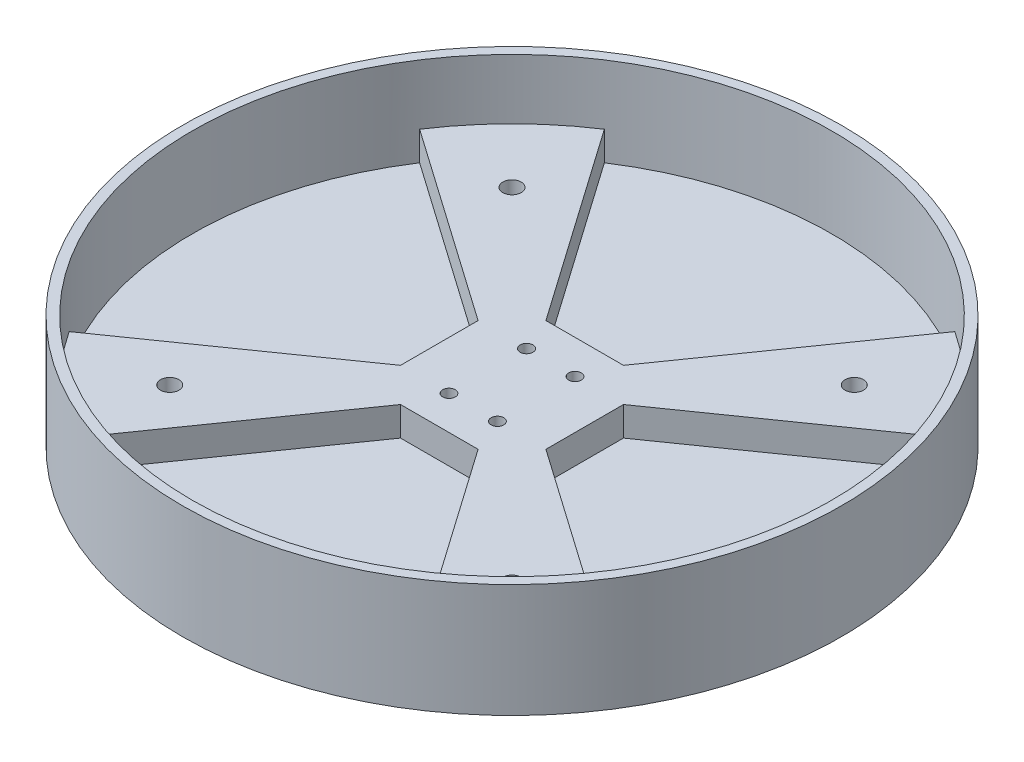
ISO-10303-21;
HEADER;
FILE_DESCRIPTION(('STEP AP214'),'2;1');
FILE_NAME('part.step','',(''),(''),'','','');
FILE_SCHEMA(('AUTOMOTIVE_DESIGN { 1 0 10303 214 1 1 1 1 }'));
ENDSEC;
DATA;
#1=APPLICATION_CONTEXT('core data for automotive mechanical design processes');
#2=APPLICATION_PROTOCOL_DEFINITION('international standard','automotive_design',2000,#1);
#3=PRODUCT_CONTEXT('',#1,'mechanical');
#4=PRODUCT('Part','Part','',(#3));
#5=PRODUCT_RELATED_PRODUCT_CATEGORY('part','',(#4));
#6=PRODUCT_DEFINITION_FORMATION('','',#4);
#7=PRODUCT_DEFINITION_CONTEXT('part definition',#1,'design');
#8=PRODUCT_DEFINITION('design','',#6,#7);
#9=PRODUCT_DEFINITION_SHAPE('','',#8);
#10=(LENGTH_UNIT() NAMED_UNIT(*) SI_UNIT(.MILLI.,.METRE.));
#11=(NAMED_UNIT(*) PLANE_ANGLE_UNIT() SI_UNIT($,.RADIAN.));
#12=(NAMED_UNIT(*) SI_UNIT($,.STERADIAN.) SOLID_ANGLE_UNIT());
#13=UNCERTAINTY_MEASURE_WITH_UNIT(LENGTH_MEASURE(1.E-05),#10,'distance_accuracy_value','');
#14=(GEOMETRIC_REPRESENTATION_CONTEXT(3) GLOBAL_UNCERTAINTY_ASSIGNED_CONTEXT((#13)) GLOBAL_UNIT_ASSIGNED_CONTEXT((#10,
#11,#12)) REPRESENTATION_CONTEXT('',''));
#15=CARTESIAN_POINT('',(0.,0.,0.));
#16=DIRECTION('',(0.,0.,1.));
#17=DIRECTION('',(1.,0.,0.));
#18=AXIS2_PLACEMENT_3D('',#15,#16,#17);
#19=CARTESIAN_POINT('',(0.,28.45,0.));
#20=DIRECTION('',(0.,1.,0.));
#21=DIRECTION('',(0.,0.,1.));
#22=AXIS2_PLACEMENT_3D('',#19,#20,#21);
#23=PLANE('',#22);
#24=CARTESIAN_POINT('',(0.,28.45,0.));
#25=DIRECTION('',(0.,1.,0.));
#26=DIRECTION('',(0.,0.,1.));
#27=AXIS2_PLACEMENT_3D('',#24,#25,#26);
#28=CIRCLE('',#27,86.36);
#29=CARTESIAN_POINT('',(0.,28.45,86.36));
#30=VERTEX_POINT('',#29);
#31=EDGE_CURVE('E213',#30,#30,#28,.T.);
#32=ORIENTED_EDGE('',*,*,#31,.T.);
#33=EDGE_LOOP('',(#32));
#34=FACE_BOUND('',#33,.T.);
#35=CARTESIAN_POINT('',(0.,28.45,0.));
#36=DIRECTION('',(0.,1.,0.));
#37=DIRECTION('',(0.,0.,1.));
#38=AXIS2_PLACEMENT_3D('',#35,#36,#37);
#39=CIRCLE('',#38,83.82);
#40=CARTESIAN_POINT('',(0.,28.45,83.82));
#41=VERTEX_POINT('',#40);
#42=EDGE_CURVE('E217',#41,#41,#39,.T.);
#43=ORIENTED_EDGE('',*,*,#42,.F.);
#44=EDGE_LOOP('',(#43));
#45=FACE_BOUND('',#44,.T.);
#46=ADVANCED_FACE('F47',(#34,#45),#23,.T.);
#47=CARTESIAN_POINT('',(0.,28.45,0.));
#48=DIRECTION('',(0.,-1.,0.));
#49=DIRECTION('',(0.,0.,-1.));
#50=AXIS2_PLACEMENT_3D('',#47,#48,#49);
#51=CYLINDRICAL_SURFACE('',#50,86.36);
#52=ORIENTED_EDGE('',*,*,#31,.F.);
#53=EDGE_LOOP('',(#52));
#54=FACE_BOUND('',#53,.T.);
#55=CARTESIAN_POINT('',(0.,-1.27,0.));
#56=DIRECTION('',(0.,1.,0.));
#57=DIRECTION('',(0.,0.,1.));
#58=AXIS2_PLACEMENT_3D('',#55,#56,#57);
#59=CIRCLE('',#58,86.36);
#60=CARTESIAN_POINT('',(0.,-1.27,86.36));
#61=VERTEX_POINT('',#60);
#62=EDGE_CURVE('E225',#61,#61,#59,.T.);
#63=ORIENTED_EDGE('',*,*,#62,.T.);
#64=EDGE_LOOP('',(#63));
#65=FACE_BOUND('',#64,.T.);
#66=ADVANCED_FACE('F51',(#54,#65),#51,.T.);
#67=CARTESIAN_POINT('',(0.,28.45,0.));
#68=DIRECTION('',(0.,-1.,0.));
#69=DIRECTION('',(0.,0.,-1.));
#70=AXIS2_PLACEMENT_3D('',#67,#68,#69);
#71=CYLINDRICAL_SURFACE('',#70,83.82);
#72=CARTESIAN_POINT('',(0.,12.7,0.));
#73=DIRECTION('',(0.,1.,0.));
#74=DIRECTION('',(0.,0.,1.));
#75=AXIS2_PLACEMENT_3D('',#72,#73,#74);
#76=CIRCLE('',#75,83.82);
#77=CARTESIAN_POINT('',(45.920860176019,12.7,70.1218011797651));
#78=VERTEX_POINT('',#77);
#79=CARTESIAN_POINT('',(70.1218011797649,12.7,45.9208601760193));
#80=VERTEX_POINT('',#79);
#81=EDGE_CURVE('E12',#78,#80,#76,.T.);
#82=ORIENTED_EDGE('',*,*,#81,.F.);
#83=DIRECTION('',(0.,1.,0.));
#84=VECTOR('',#83,1.);
#85=CARTESIAN_POINT('',(45.920860176019,5.08,70.1218011797651));
#86=LINE('',#85,#84);
#87=CARTESIAN_POINT('',(45.920860176019,5.08,70.1218011797651));
#88=VERTEX_POINT('',#87);
#89=EDGE_CURVE('E401',#88,#78,#86,.T.);
#90=ORIENTED_EDGE('',*,*,#89,.F.);
#91=CARTESIAN_POINT('',(0.,5.08,0.));
#92=DIRECTION('',(0.,1.,0.));
#93=DIRECTION('',(0.,0.,1.));
#94=AXIS2_PLACEMENT_3D('',#91,#92,#93);
#95=CIRCLE('',#94,83.82);
#96=CARTESIAN_POINT('',(-45.9208601760193,5.08,70.1218011797649));
#97=VERTEX_POINT('',#96);
#98=EDGE_CURVE('E171',#97,#88,#95,.T.);
#99=ORIENTED_EDGE('',*,*,#98,.F.);
#100=DIRECTION('',(0.,1.,0.));
#101=VECTOR('',#100,1.);
#102=CARTESIAN_POINT('',(-45.9208601760193,5.08,70.1218011797649));
#103=LINE('',#102,#101);
#104=CARTESIAN_POINT('',(-45.9208601760193,12.7,70.1218011797649));
#105=VERTEX_POINT('',#104);
#106=EDGE_CURVE('E165',#97,#105,#103,.T.);
#107=ORIENTED_EDGE('',*,*,#106,.T.);
#108=CARTESIAN_POINT('',(-70.1218011797652,12.7,45.920860176019));
#109=VERTEX_POINT('',#108);
#110=EDGE_CURVE('E56',#109,#105,#76,.T.);
#111=ORIENTED_EDGE('',*,*,#110,.F.);
#112=DIRECTION('',(0.,1.,0.));
#113=VECTOR('',#112,1.);
#114=CARTESIAN_POINT('',(-70.1218011797652,5.08,45.920860176019));
#115=LINE('',#114,#113);
#116=CARTESIAN_POINT('',(-70.1218011797652,5.08,45.920860176019));
#117=VERTEX_POINT('',#116);
#118=EDGE_CURVE('E273',#117,#109,#115,.T.);
#119=ORIENTED_EDGE('',*,*,#118,.F.);
#120=CARTESIAN_POINT('',(0.,5.08,0.));
#121=DIRECTION('',(0.,1.,0.));
#122=DIRECTION('',(0.,0.,1.));
#123=AXIS2_PLACEMENT_3D('',#120,#121,#122);
#124=CIRCLE('',#123,83.82);
#125=CARTESIAN_POINT('',(-70.1218011797649,5.08,-45.9208601760194));
#126=VERTEX_POINT('',#125);
#127=EDGE_CURVE('E292',#126,#117,#124,.T.);
#128=ORIENTED_EDGE('',*,*,#127,.F.);
#129=DIRECTION('',(0.,1.,0.));
#130=VECTOR('',#129,1.);
#131=CARTESIAN_POINT('',(-70.1218011797649,5.08,-45.9208601760194));
#132=LINE('',#131,#130);
#133=CARTESIAN_POINT('',(-70.1218011797649,12.7,-45.9208601760194));
#134=VERTEX_POINT('',#133);
#135=EDGE_CURVE('E259',#126,#134,#132,.T.);
#136=ORIENTED_EDGE('',*,*,#135,.T.);
#137=CARTESIAN_POINT('',(-45.920860176019,12.7,-70.1218011797651));
#138=VERTEX_POINT('',#137);
#139=EDGE_CURVE('E195',#138,#134,#76,.T.);
#140=ORIENTED_EDGE('',*,*,#139,.F.);
#141=DIRECTION('',(0.,1.,0.));
#142=VECTOR('',#141,1.);
#143=CARTESIAN_POINT('',(-45.920860176019,5.08,-70.1218011797651));
#144=LINE('',#143,#142);
#145=CARTESIAN_POINT('',(-45.920860176019,5.08,-70.1218011797651));
#146=VERTEX_POINT('',#145);
#147=EDGE_CURVE('E329',#146,#138,#144,.T.);
#148=ORIENTED_EDGE('',*,*,#147,.F.);
#149=CARTESIAN_POINT('',(0.,5.08,0.));
#150=DIRECTION('',(0.,1.,0.));
#151=DIRECTION('',(0.,0.,1.));
#152=AXIS2_PLACEMENT_3D('',#149,#150,#151);
#153=CIRCLE('',#152,83.82);
#154=CARTESIAN_POINT('',(45.9208601760193,5.08,-70.1218011797649));
#155=VERTEX_POINT('',#154);
#156=EDGE_CURVE('E312',#155,#146,#153,.T.);
#157=ORIENTED_EDGE('',*,*,#156,.F.);
#158=DIRECTION('',(0.,1.,0.));
#159=VECTOR('',#158,1.);
#160=CARTESIAN_POINT('',(45.9208601760193,5.08,-70.1218011797649));
#161=LINE('',#160,#159);
#162=CARTESIAN_POINT('',(45.9208601760193,12.7,-70.1218011797649));
#163=VERTEX_POINT('',#162);
#164=EDGE_CURVE('E338',#155,#163,#161,.T.);
#165=ORIENTED_EDGE('',*,*,#164,.T.);
#166=CARTESIAN_POINT('',(70.1218011797651,12.7,-45.920860176019));
#167=VERTEX_POINT('',#166);
#168=EDGE_CURVE('E59',#167,#163,#76,.T.);
#169=ORIENTED_EDGE('',*,*,#168,.F.);
#170=DIRECTION('',(0.,1.,0.));
#171=VECTOR('',#170,1.);
#172=CARTESIAN_POINT('',(70.1218011797651,5.08,-45.920860176019));
#173=LINE('',#172,#171);
#174=CARTESIAN_POINT('',(70.1218011797651,5.08,-45.920860176019));
#175=VERTEX_POINT('',#174);
#176=EDGE_CURVE('E368',#175,#167,#173,.T.);
#177=ORIENTED_EDGE('',*,*,#176,.F.);
#178=CARTESIAN_POINT('',(0.,5.08,0.));
#179=DIRECTION('',(0.,1.,0.));
#180=DIRECTION('',(0.,0.,1.));
#181=AXIS2_PLACEMENT_3D('',#178,#179,#180);
#182=CIRCLE('',#181,83.82);
#183=CARTESIAN_POINT('',(70.1218011797649,5.08,45.9208601760193));
#184=VERTEX_POINT('',#183);
#185=EDGE_CURVE('E353',#184,#175,#182,.T.);
#186=ORIENTED_EDGE('',*,*,#185,.F.);
#187=DIRECTION('',(0.,1.,0.));
#188=VECTOR('',#187,1.);
#189=CARTESIAN_POINT('',(70.1218011797649,5.08,45.9208601760193));
#190=LINE('',#189,#188);
#191=EDGE_CURVE('E377',#184,#80,#190,.T.);
#192=ORIENTED_EDGE('',*,*,#191,.T.);
#193=EDGE_LOOP('',(#82,#90,#99,#107,#111,#119,#128,#136,#140,#148,#157,#165,#169,#177,#186,#192));
#194=FACE_BOUND('',#193,.T.);
#195=ORIENTED_EDGE('',*,*,#42,.T.);
#196=EDGE_LOOP('',(#195));
#197=FACE_BOUND('',#196,.T.);
#198=ADVANCED_FACE('F170',(#194,#197),#71,.F.);
#199=CARTESIAN_POINT('',(0.,-1.27,0.));
#200=DIRECTION('',(0.,1.,0.));
#201=DIRECTION('',(0.,0.,1.));
#202=AXIS2_PLACEMENT_3D('',#199,#200,#201);
#203=PLANE('',#202);
#204=ORIENTED_EDGE('',*,*,#62,.F.);
#205=EDGE_LOOP('',(#204));
#206=FACE_BOUND('',#205,.T.);
#207=ADVANCED_FACE('F451',(#206),#203,.F.);
#208=CARTESIAN_POINT('',(44.845,12.7,-44.845));
#209=DIRECTION('',(0.,-1.,0.));
#210=DIRECTION('',(0.,0.,-1.));
#211=AXIS2_PLACEMENT_3D('',#208,#209,#210);
#212=CYLINDRICAL_SURFACE('',#211,2.41299999999999);
#213=CARTESIAN_POINT('',(44.845,12.7,-44.845));
#214=DIRECTION('',(0.,1.,0.));
#215=DIRECTION('',(0.,0.,1.));
#216=AXIS2_PLACEMENT_3D('',#213,#214,#215);
#217=CIRCLE('',#216,2.41299999999999);
#218=CARTESIAN_POINT('',(44.845,12.7,-42.432));
#219=VERTEX_POINT('',#218);
#220=EDGE_CURVE('E228',#219,#219,#217,.T.);
#221=ORIENTED_EDGE('',*,*,#220,.T.);
#222=EDGE_LOOP('',(#221));
#223=FACE_BOUND('',#222,.T.);
#224=CARTESIAN_POINT('',(44.845,0.,-44.845));
#225=DIRECTION('',(0.,1.,0.));
#226=DIRECTION('',(0.,0.,1.));
#227=AXIS2_PLACEMENT_3D('',#224,#225,#226);
#228=CIRCLE('',#227,2.41299999999999);
#229=CARTESIAN_POINT('',(44.845,0.,-42.432));
#230=VERTEX_POINT('',#229);
#231=EDGE_CURVE('E193',#230,#230,#228,.F.);
#232=ORIENTED_EDGE('',*,*,#231,.T.);
#233=EDGE_LOOP('',(#232));
#234=FACE_BOUND('',#233,.T.);
#235=ADVANCED_FACE('F465',(#223,#234),#212,.F.);
#236=CARTESIAN_POINT('',(44.845,12.7,44.845));
#237=DIRECTION('',(0.,-1.,0.));
#238=DIRECTION('',(0.,0.,-1.));
#239=AXIS2_PLACEMENT_3D('',#236,#237,#238);
#240=CYLINDRICAL_SURFACE('',#239,2.41299999999999);
#241=CARTESIAN_POINT('',(44.845,12.7,44.845));
#242=DIRECTION('',(0.,1.,0.));
#243=DIRECTION('',(0.,0.,1.));
#244=AXIS2_PLACEMENT_3D('',#241,#242,#243);
#245=CIRCLE('',#244,2.41299999999999);
#246=CARTESIAN_POINT('',(44.845,12.7,47.258));
#247=VERTEX_POINT('',#246);
#248=EDGE_CURVE('E229',#247,#247,#245,.T.);
#249=ORIENTED_EDGE('',*,*,#248,.T.);
#250=EDGE_LOOP('',(#249));
#251=FACE_BOUND('',#250,.T.);
#252=CARTESIAN_POINT('',(44.845,0.,44.845));
#253=DIRECTION('',(0.,1.,0.));
#254=DIRECTION('',(0.,0.,1.));
#255=AXIS2_PLACEMENT_3D('',#252,#253,#254);
#256=CIRCLE('',#255,2.41299999999999);
#257=CARTESIAN_POINT('',(44.845,0.,47.258));
#258=VERTEX_POINT('',#257);
#259=EDGE_CURVE('E198',#258,#258,#256,.F.);
#260=ORIENTED_EDGE('',*,*,#259,.T.);
#261=EDGE_LOOP('',(#260));
#262=FACE_BOUND('',#261,.T.);
#263=ADVANCED_FACE('F474',(#251,#262),#240,.F.);
#264=CARTESIAN_POINT('',(-44.845,12.7,44.845));
#265=DIRECTION('',(0.,-1.,0.));
#266=DIRECTION('',(0.,0.,-1.));
#267=AXIS2_PLACEMENT_3D('',#264,#265,#266);
#268=CYLINDRICAL_SURFACE('',#267,2.41299999999999);
#269=CARTESIAN_POINT('',(-44.845,12.7,44.845));
#270=DIRECTION('',(0.,1.,0.));
#271=DIRECTION('',(0.,0.,1.));
#272=AXIS2_PLACEMENT_3D('',#269,#270,#271);
#273=CIRCLE('',#272,2.41299999999999);
#274=CARTESIAN_POINT('',(-44.845,12.7,47.258));
#275=VERTEX_POINT('',#274);
#276=EDGE_CURVE('E234',#275,#275,#273,.T.);
#277=ORIENTED_EDGE('',*,*,#276,.T.);
#278=EDGE_LOOP('',(#277));
#279=FACE_BOUND('',#278,.T.);
#280=CARTESIAN_POINT('',(-44.845,0.,44.845));
#281=DIRECTION('',(0.,1.,0.));
#282=DIRECTION('',(0.,0.,1.));
#283=AXIS2_PLACEMENT_3D('',#280,#281,#282);
#284=CIRCLE('',#283,2.41299999999999);
#285=CARTESIAN_POINT('',(-44.845,0.,47.258));
#286=VERTEX_POINT('',#285);
#287=EDGE_CURVE('E204',#286,#286,#284,.F.);
#288=ORIENTED_EDGE('',*,*,#287,.T.);
#289=EDGE_LOOP('',(#288));
#290=FACE_BOUND('',#289,.T.);
#291=ADVANCED_FACE('F470',(#279,#290),#268,.F.);
#292=CARTESIAN_POINT('',(-44.845,12.7,-44.845));
#293=DIRECTION('',(0.,-1.,0.));
#294=DIRECTION('',(0.,0.,-1.));
#295=AXIS2_PLACEMENT_3D('',#292,#293,#294);
#296=CYLINDRICAL_SURFACE('',#295,2.41299999999999);
#297=CARTESIAN_POINT('',(-44.845,12.7,-44.845));
#298=DIRECTION('',(0.,1.,0.));
#299=DIRECTION('',(0.,0.,1.));
#300=AXIS2_PLACEMENT_3D('',#297,#298,#299);
#301=CIRCLE('',#300,2.41299999999999);
#302=CARTESIAN_POINT('',(-44.845,12.7,-42.432));
#303=VERTEX_POINT('',#302);
#304=EDGE_CURVE('E238',#303,#303,#301,.T.);
#305=ORIENTED_EDGE('',*,*,#304,.T.);
#306=EDGE_LOOP('',(#305));
#307=FACE_BOUND('',#306,.T.);
#308=CARTESIAN_POINT('',(-44.845,0.,-44.845));
#309=DIRECTION('',(0.,1.,0.));
#310=DIRECTION('',(0.,0.,1.));
#311=AXIS2_PLACEMENT_3D('',#308,#309,#310);
#312=CIRCLE('',#311,2.41299999999999);
#313=CARTESIAN_POINT('',(-44.845,0.,-42.432));
#314=VERTEX_POINT('',#313);
#315=EDGE_CURVE('E208',#314,#314,#312,.F.);
#316=ORIENTED_EDGE('',*,*,#315,.T.);
#317=EDGE_LOOP('',(#316));
#318=FACE_BOUND('',#317,.T.);
#319=ADVANCED_FACE('F464',(#307,#318),#296,.F.);
#320=CARTESIAN_POINT('',(0.,12.7,0.));
#321=DIRECTION('',(0.,1.,0.));
#322=DIRECTION('',(0.,0.,1.));
#323=AXIS2_PLACEMENT_3D('',#320,#321,#322);
#324=PLANE('',#323);
#325=DIRECTION('',(-0.819152044288991,0.,0.573576436351047));
#326=VECTOR('',#325,1.);
#327=CARTESIAN_POINT('',(70.1218011797651,12.7,-45.920860176019));
#328=LINE('',#327,#326);
#329=CARTESIAN_POINT('',(19.0500000000001,12.7,-10.1599999999999));
#330=VERTEX_POINT('',#329);
#331=EDGE_CURVE('E66',#167,#330,#328,.T.);
#332=ORIENTED_EDGE('',*,*,#331,.F.);
#333=ORIENTED_EDGE('',*,*,#168,.T.);
#334=DIRECTION('',(0.573576436351049,0.,-0.81915204428899));
#335=VECTOR('',#334,1.);
#336=CARTESIAN_POINT('',(45.9208601760193,12.7,-70.1218011797649));
#337=LINE('',#336,#335);
#338=CARTESIAN_POINT('',(10.1600000000001,12.7,-19.05));
#339=VERTEX_POINT('',#338);
#340=EDGE_CURVE('E320',#339,#163,#337,.T.);
#341=ORIENTED_EDGE('',*,*,#340,.F.);
#342=DIRECTION('',(1.,0.,0.));
#343=VECTOR('',#342,1.);
#344=CARTESIAN_POINT('',(-10.1599999999999,12.7,-19.05));
#345=LINE('',#344,#343);
#346=CARTESIAN_POINT('',(-10.1599999999999,12.7,-19.05));
#347=VERTEX_POINT('',#346);
#348=EDGE_CURVE('E331',#347,#339,#345,.T.);
#349=ORIENTED_EDGE('',*,*,#348,.F.);
#350=DIRECTION('',(0.573576436351046,0.,0.819152044288992));
#351=VECTOR('',#350,1.);
#352=CARTESIAN_POINT('',(-45.920860176019,12.7,-70.1218011797651));
#353=LINE('',#352,#351);
#354=EDGE_CURVE('E74',#138,#347,#353,.T.);
#355=ORIENTED_EDGE('',*,*,#354,.F.);
#356=ORIENTED_EDGE('',*,*,#139,.T.);
#357=DIRECTION('',(-0.819152044288989,0.,-0.57357643635105));
#358=VECTOR('',#357,1.);
#359=CARTESIAN_POINT('',(-70.1218011797649,12.7,-45.9208601760194));
#360=LINE('',#359,#358);
#361=CARTESIAN_POINT('',(-19.05,12.7,-10.16));
#362=VERTEX_POINT('',#361);
#363=EDGE_CURVE('E286',#362,#134,#360,.T.);
#364=ORIENTED_EDGE('',*,*,#363,.F.);
#365=DIRECTION('',(0.,0.,-1.));
#366=VECTOR('',#365,1.);
#367=CARTESIAN_POINT('',(-19.05,12.7,10.16));
#368=LINE('',#367,#366);
#369=CARTESIAN_POINT('',(-19.05,12.7,10.16));
#370=VERTEX_POINT('',#369);
#371=EDGE_CURVE('E291',#370,#362,#368,.T.);
#372=ORIENTED_EDGE('',*,*,#371,.F.);
#373=DIRECTION('',(0.819152044288993,0.,-0.573576436351044));
#374=VECTOR('',#373,1.);
#375=CARTESIAN_POINT('',(-70.1218011797652,12.7,45.920860176019));
#376=LINE('',#375,#374);
#377=EDGE_CURVE('E194',#109,#370,#376,.T.);
#378=ORIENTED_EDGE('',*,*,#377,.F.);
#379=ORIENTED_EDGE('',*,*,#110,.T.);
#380=DIRECTION('',(-0.573576436351047,0.,0.819152044288991));
#381=VECTOR('',#380,1.);
#382=CARTESIAN_POINT('',(-45.9208601760193,12.7,70.1218011797649));
#383=LINE('',#382,#381);
#384=CARTESIAN_POINT('',(-10.1600000000002,12.7,19.0499999999999));
#385=VERTEX_POINT('',#384);
#386=EDGE_CURVE('E177',#385,#105,#383,.T.);
#387=ORIENTED_EDGE('',*,*,#386,.F.);
#388=DIRECTION('',(-1.,0.,0.));
#389=VECTOR('',#388,1.);
#390=CARTESIAN_POINT('',(10.1599999999998,12.7,19.0500000000001));
#391=LINE('',#390,#389);
#392=CARTESIAN_POINT('',(10.1599999999998,12.7,19.0500000000001));
#393=VERTEX_POINT('',#392);
#394=EDGE_CURVE('E184',#393,#385,#391,.T.);
#395=ORIENTED_EDGE('',*,*,#394,.F.);
#396=DIRECTION('',(-0.573576436351048,0.,-0.819152044288991));
#397=VECTOR('',#396,1.);
#398=CARTESIAN_POINT('',(45.920860176019,12.7,70.1218011797651));
#399=LINE('',#398,#397);
#400=EDGE_CURVE('E385',#78,#393,#399,.T.);
#401=ORIENTED_EDGE('',*,*,#400,.F.);
#402=ORIENTED_EDGE('',*,*,#81,.T.);
#403=DIRECTION('',(0.81915204428899,0.,0.573576436351048));
#404=VECTOR('',#403,1.);
#405=CARTESIAN_POINT('',(70.1218011797649,12.7,45.9208601760193));
#406=LINE('',#405,#404);
#407=CARTESIAN_POINT('',(19.0499999999999,12.7,10.1600000000001));
#408=VERTEX_POINT('',#407);
#409=EDGE_CURVE('E352',#408,#80,#406,.T.);
#410=ORIENTED_EDGE('',*,*,#409,.F.);
#411=DIRECTION('',(0.,0.,1.));
#412=VECTOR('',#411,1.);
#413=CARTESIAN_POINT('',(19.0500000000001,12.7,-10.1599999999999));
#414=LINE('',#413,#412);
#415=EDGE_CURVE('E371',#330,#408,#414,.T.);
#416=ORIENTED_EDGE('',*,*,#415,.F.);
#417=EDGE_LOOP('',(#332,#333,#341,#349,#355,#356,#364,#372,#378,#379,#387,#395,#401,#402,#410,#416));
#418=FACE_BOUND('',#417,.T.);
#419=CARTESIAN_POINT('',(-6.35,12.7,-10.16));
#420=DIRECTION('',(0.,1.,0.));
#421=DIRECTION('',(0.,0.,1.));
#422=AXIS2_PLACEMENT_3D('',#419,#420,#421);
#423=CIRCLE('',#422,1.68128652093225);
#424=CARTESIAN_POINT('',(-6.35,12.7,-8.47871347906775));
#425=VERTEX_POINT('',#424);
#426=EDGE_CURVE('E253',#425,#425,#423,.T.);
#427=ORIENTED_EDGE('',*,*,#426,.F.);
#428=EDGE_LOOP('',(#427));
#429=FACE_BOUND('',#428,.T.);
#430=CARTESIAN_POINT('',(-6.35,12.7,10.16));
#431=DIRECTION('',(0.,1.,0.));
#432=DIRECTION('',(0.,0.,1.));
#433=AXIS2_PLACEMENT_3D('',#430,#431,#432);
#434=CIRCLE('',#433,1.651);
#435=CARTESIAN_POINT('',(-6.35,12.7,11.811));
#436=VERTEX_POINT('',#435);
#437=EDGE_CURVE('E263',#436,#436,#434,.T.);
#438=ORIENTED_EDGE('',*,*,#437,.F.);
#439=EDGE_LOOP('',(#438));
#440=FACE_BOUND('',#439,.T.);
#441=CARTESIAN_POINT('',(6.35,12.7,10.16));
#442=DIRECTION('',(0.,1.,0.));
#443=DIRECTION('',(0.,0.,1.));
#444=AXIS2_PLACEMENT_3D('',#441,#442,#443);
#445=CIRCLE('',#444,1.651);
#446=CARTESIAN_POINT('',(6.35,12.7,11.811));
#447=VERTEX_POINT('',#446);
#448=EDGE_CURVE('E250',#447,#447,#445,.T.);
#449=ORIENTED_EDGE('',*,*,#448,.F.);
#450=EDGE_LOOP('',(#449));
#451=FACE_BOUND('',#450,.T.);
#452=CARTESIAN_POINT('',(6.35,12.7,-10.16));
#453=DIRECTION('',(0.,1.,0.));
#454=DIRECTION('',(0.,0.,1.));
#455=AXIS2_PLACEMENT_3D('',#452,#453,#454);
#456=CIRCLE('',#455,1.651);
#457=CARTESIAN_POINT('',(6.35,12.7,-8.509));
#458=VERTEX_POINT('',#457);
#459=EDGE_CURVE('E243',#458,#458,#456,.T.);
#460=ORIENTED_EDGE('',*,*,#459,.F.);
#461=EDGE_LOOP('',(#460));
#462=FACE_BOUND('',#461,.T.);
#463=ORIENTED_EDGE('',*,*,#304,.F.);
#464=EDGE_LOOP('',(#463));
#465=FACE_BOUND('',#464,.T.);
#466=ORIENTED_EDGE('',*,*,#276,.F.);
#467=EDGE_LOOP('',(#466));
#468=FACE_BOUND('',#467,.T.);
#469=ORIENTED_EDGE('',*,*,#248,.F.);
#470=EDGE_LOOP('',(#469));
#471=FACE_BOUND('',#470,.T.);
#472=ORIENTED_EDGE('',*,*,#220,.F.);
#473=EDGE_LOOP('',(#472));
#474=FACE_BOUND('',#473,.T.);
#475=ADVANCED_FACE('F189',(#418,#429,#440,#451,#462,#465,#468,#471,#474),#324,.T.);
#476=CARTESIAN_POINT('',(0.,0.,0.));
#477=DIRECTION('',(0.,1.,0.));
#478=DIRECTION('',(0.,0.,1.));
#479=AXIS2_PLACEMENT_3D('',#476,#477,#478);
#480=PLANE('',#479);
#481=ORIENTED_EDGE('',*,*,#315,.F.);
#482=EDGE_LOOP('',(#481));
#483=FACE_BOUND('',#482,.T.);
#484=ADVANCED_FACE('F458',(#483),#480,.T.);
#485=ORIENTED_EDGE('',*,*,#287,.F.);
#486=EDGE_LOOP('',(#485));
#487=FACE_BOUND('',#486,.T.);
#488=ADVANCED_FACE('F718',(#487),#480,.T.);
#489=ORIENTED_EDGE('',*,*,#259,.F.);
#490=EDGE_LOOP('',(#489));
#491=FACE_BOUND('',#490,.T.);
#492=ADVANCED_FACE('F460',(#491),#480,.T.);
#493=ORIENTED_EDGE('',*,*,#231,.F.);
#494=EDGE_LOOP('',(#493));
#495=FACE_BOUND('',#494,.T.);
#496=ADVANCED_FACE('F455',(#495),#480,.T.);
#497=CARTESIAN_POINT('',(6.35,10.16,-10.16));
#498=DIRECTION('',(0.,1.,0.));
#499=DIRECTION('',(0.,0.,1.));
#500=AXIS2_PLACEMENT_3D('',#497,#498,#499);
#501=CYLINDRICAL_SURFACE('',#500,1.651);
#502=CARTESIAN_POINT('',(6.35,10.16,-10.16));
#503=DIRECTION('',(0.,1.,0.));
#504=DIRECTION('',(0.,0.,1.));
#505=AXIS2_PLACEMENT_3D('',#502,#503,#504);
#506=CIRCLE('',#505,1.651);
#507=CARTESIAN_POINT('',(6.35,10.16,-8.509));
#508=VERTEX_POINT('',#507);
#509=EDGE_CURVE('E245',#508,#508,#506,.T.);
#510=ORIENTED_EDGE('',*,*,#509,.F.);
#511=EDGE_LOOP('',(#510));
#512=FACE_BOUND('',#511,.T.);
#513=ORIENTED_EDGE('',*,*,#459,.T.);
#514=EDGE_LOOP('',(#513));
#515=FACE_BOUND('',#514,.T.);
#516=ADVANCED_FACE('F456',(#512,#515),#501,.F.);
#517=CARTESIAN_POINT('',(6.35,10.16,-10.16));
#518=DIRECTION('',(0.,1.,0.));
#519=DIRECTION('',(0.,0.,1.));
#520=AXIS2_PLACEMENT_3D('',#517,#518,#519);
#521=PLANE('',#520);
#522=ORIENTED_EDGE('',*,*,#509,.T.);
#523=EDGE_LOOP('',(#522));
#524=FACE_BOUND('',#523,.T.);
#525=ADVANCED_FACE('F481',(#524),#521,.T.);
#526=CARTESIAN_POINT('',(6.35,10.16,10.16));
#527=DIRECTION('',(0.,1.,0.));
#528=DIRECTION('',(0.,0.,1.));
#529=AXIS2_PLACEMENT_3D('',#526,#527,#528);
#530=CYLINDRICAL_SURFACE('',#529,1.651);
#531=CARTESIAN_POINT('',(6.35,10.16,10.16));
#532=DIRECTION('',(0.,1.,0.));
#533=DIRECTION('',(0.,0.,1.));
#534=AXIS2_PLACEMENT_3D('',#531,#532,#533);
#535=CIRCLE('',#534,1.651);
#536=CARTESIAN_POINT('',(6.35,10.16,11.811));
#537=VERTEX_POINT('',#536);
#538=EDGE_CURVE('E266',#537,#537,#535,.T.);
#539=ORIENTED_EDGE('',*,*,#538,.F.);
#540=EDGE_LOOP('',(#539));
#541=FACE_BOUND('',#540,.T.);
#542=ORIENTED_EDGE('',*,*,#448,.T.);
#543=EDGE_LOOP('',(#542));
#544=FACE_BOUND('',#543,.T.);
#545=ADVANCED_FACE('F487',(#541,#544),#530,.F.);
#546=CARTESIAN_POINT('',(6.35,10.16,10.16));
#547=DIRECTION('',(0.,1.,0.));
#548=DIRECTION('',(0.,0.,1.));
#549=AXIS2_PLACEMENT_3D('',#546,#547,#548);
#550=PLANE('',#549);
#551=ORIENTED_EDGE('',*,*,#538,.T.);
#552=EDGE_LOOP('',(#551));
#553=FACE_BOUND('',#552,.T.);
#554=ADVANCED_FACE('F504',(#553),#550,.T.);
#555=CARTESIAN_POINT('',(-6.35,10.16,10.16));
#556=DIRECTION('',(0.,1.,0.));
#557=DIRECTION('',(0.,0.,1.));
#558=AXIS2_PLACEMENT_3D('',#555,#556,#557);
#559=CYLINDRICAL_SURFACE('',#558,1.651);
#560=CARTESIAN_POINT('',(-6.35,10.16,10.16));
#561=DIRECTION('',(0.,1.,0.));
#562=DIRECTION('',(0.,0.,1.));
#563=AXIS2_PLACEMENT_3D('',#560,#561,#562);
#564=CIRCLE('',#563,1.651);
#565=CARTESIAN_POINT('',(-6.35,10.16,11.811));
#566=VERTEX_POINT('',#565);
#567=EDGE_CURVE('E257',#566,#566,#564,.T.);
#568=ORIENTED_EDGE('',*,*,#567,.F.);
#569=EDGE_LOOP('',(#568));
#570=FACE_BOUND('',#569,.T.);
#571=ORIENTED_EDGE('',*,*,#437,.T.);
#572=EDGE_LOOP('',(#571));
#573=FACE_BOUND('',#572,.T.);
#574=ADVANCED_FACE('F501',(#570,#573),#559,.F.);
#575=CARTESIAN_POINT('',(-6.35,10.16,10.16));
#576=DIRECTION('',(0.,1.,0.));
#577=DIRECTION('',(0.,0.,1.));
#578=AXIS2_PLACEMENT_3D('',#575,#576,#577);
#579=PLANE('',#578);
#580=ORIENTED_EDGE('',*,*,#567,.T.);
#581=EDGE_LOOP('',(#580));
#582=FACE_BOUND('',#581,.T.);
#583=ADVANCED_FACE('F500',(#582),#579,.T.);
#584=CARTESIAN_POINT('',(-6.35,10.16,-10.16));
#585=DIRECTION('',(0.,1.,0.));
#586=DIRECTION('',(0.,0.,1.));
#587=AXIS2_PLACEMENT_3D('',#584,#585,#586);
#588=CYLINDRICAL_SURFACE('',#587,1.68128652093225);
#589=CARTESIAN_POINT('',(-6.35,10.16,-10.16));
#590=DIRECTION('',(0.,1.,0.));
#591=DIRECTION('',(0.,0.,1.));
#592=AXIS2_PLACEMENT_3D('',#589,#590,#591);
#593=CIRCLE('',#592,1.68128652093225);
#594=CARTESIAN_POINT('',(-6.35,10.16,-8.47871347906775));
#595=VERTEX_POINT('',#594);
#596=EDGE_CURVE('E252',#595,#595,#593,.T.);
#597=ORIENTED_EDGE('',*,*,#596,.F.);
#598=EDGE_LOOP('',(#597));
#599=FACE_BOUND('',#598,.T.);
#600=ORIENTED_EDGE('',*,*,#426,.T.);
#601=EDGE_LOOP('',(#600));
#602=FACE_BOUND('',#601,.T.);
#603=ADVANCED_FACE('F491',(#599,#602),#588,.F.);
#604=CARTESIAN_POINT('',(-6.35,10.16,-10.16));
#605=DIRECTION('',(0.,1.,0.));
#606=DIRECTION('',(0.,0.,1.));
#607=AXIS2_PLACEMENT_3D('',#604,#605,#606);
#608=PLANE('',#607);
#609=ORIENTED_EDGE('',*,*,#596,.T.);
#610=EDGE_LOOP('',(#609));
#611=FACE_BOUND('',#610,.T.);
#612=ADVANCED_FACE('F490',(#611),#608,.T.);
#613=CARTESIAN_POINT('',(-70.1218011797649,5.08,-45.9208601760194));
#614=DIRECTION('',(0.57357643635105,0.,-0.819152044288989));
#615=DIRECTION('',(-0.819152044288989,0.,-0.57357643635105));
#616=AXIS2_PLACEMENT_3D('',#613,#614,#615);
#617=PLANE('',#616);
#618=ORIENTED_EDGE('',*,*,#363,.T.);
#619=ORIENTED_EDGE('',*,*,#135,.F.);
#620=DIRECTION('',(-0.819152044288989,0.,-0.57357643635105));
#621=VECTOR('',#620,1.);
#622=CARTESIAN_POINT('',(-70.1218011797649,5.08,-45.9208601760194));
#623=LINE('',#622,#621);
#624=CARTESIAN_POINT('',(-19.05,5.08,-10.16));
#625=VERTEX_POINT('',#624);
#626=EDGE_CURVE('E278',#625,#126,#623,.T.);
#627=ORIENTED_EDGE('',*,*,#626,.F.);
#628=DIRECTION('',(0.,1.,0.));
#629=VECTOR('',#628,1.);
#630=CARTESIAN_POINT('',(-19.05,5.08,-10.16));
#631=LINE('',#630,#629);
#632=EDGE_CURVE('E282',#625,#362,#631,.T.);
#633=ORIENTED_EDGE('',*,*,#632,.T.);
#634=EDGE_LOOP('',(#618,#619,#627,#633));
#635=FACE_BOUND('',#634,.T.);
#636=ADVANCED_FACE('F495',(#635),#617,.F.);
#637=CARTESIAN_POINT('',(-19.05,5.08,10.16));
#638=DIRECTION('',(1.,0.,0.));
#639=DIRECTION('',(0.,0.,-1.));
#640=AXIS2_PLACEMENT_3D('',#637,#638,#639);
#641=PLANE('',#640);
#642=ORIENTED_EDGE('',*,*,#371,.T.);
#643=ORIENTED_EDGE('',*,*,#632,.F.);
#644=DIRECTION('',(0.,0.,-1.));
#645=VECTOR('',#644,1.);
#646=CARTESIAN_POINT('',(-19.05,5.08,10.16));
#647=LINE('',#646,#645);
#648=CARTESIAN_POINT('',(-19.05,5.08,10.16));
#649=VERTEX_POINT('',#648);
#650=EDGE_CURVE('E305',#649,#625,#647,.T.);
#651=ORIENTED_EDGE('',*,*,#650,.F.);
#652=DIRECTION('',(0.,1.,0.));
#653=VECTOR('',#652,1.);
#654=CARTESIAN_POINT('',(-19.05,5.08,10.16));
#655=LINE('',#654,#653);
#656=EDGE_CURVE('E280',#649,#370,#655,.T.);
#657=ORIENTED_EDGE('',*,*,#656,.T.);
#658=EDGE_LOOP('',(#642,#643,#651,#657));
#659=FACE_BOUND('',#658,.T.);
#660=ADVANCED_FACE('F516',(#659),#641,.F.);
#661=CARTESIAN_POINT('',(-70.1218011797652,5.08,45.920860176019));
#662=DIRECTION('',(0.573576436351044,0.,0.819152044288993));
#663=DIRECTION('',(0.819152044288993,0.,-0.573576436351044));
#664=AXIS2_PLACEMENT_3D('',#661,#662,#663);
#665=PLANE('',#664);
#666=ORIENTED_EDGE('',*,*,#377,.T.);
#667=ORIENTED_EDGE('',*,*,#656,.F.);
#668=DIRECTION('',(0.819152044288993,0.,-0.573576436351044));
#669=VECTOR('',#668,1.);
#670=CARTESIAN_POINT('',(-70.1218011797652,5.08,45.920860176019));
#671=LINE('',#670,#669);
#672=EDGE_CURVE('E306',#117,#649,#671,.T.);
#673=ORIENTED_EDGE('',*,*,#672,.F.);
#674=ORIENTED_EDGE('',*,*,#118,.T.);
#675=EDGE_LOOP('',(#666,#667,#673,#674));
#676=FACE_BOUND('',#675,.T.);
#677=ADVANCED_FACE('F514',(#676),#665,.F.);
#678=CARTESIAN_POINT('',(0.,5.08,0.));
#679=DIRECTION('',(0.,1.,0.));
#680=DIRECTION('',(0.,0.,1.));
#681=AXIS2_PLACEMENT_3D('',#678,#679,#680);
#682=PLANE('',#681);
#683=ORIENTED_EDGE('',*,*,#127,.T.);
#684=ORIENTED_EDGE('',*,*,#672,.T.);
#685=ORIENTED_EDGE('',*,*,#650,.T.);
#686=ORIENTED_EDGE('',*,*,#626,.T.);
#687=EDGE_LOOP('',(#683,#684,#685,#686));
#688=FACE_BOUND('',#687,.T.);
#689=ADVANCED_FACE('F519',(#688),#682,.T.);
#690=CARTESIAN_POINT('',(-45.9208601760193,5.08,70.1218011797649));
#691=DIRECTION('',(-0.819152044288991,0.,-0.573576436351047));
#692=DIRECTION('',(-0.573576436351047,0.,0.819152044288991));
#693=AXIS2_PLACEMENT_3D('',#690,#691,#692);
#694=PLANE('',#693);
#695=ORIENTED_EDGE('',*,*,#386,.T.);
#696=ORIENTED_EDGE('',*,*,#106,.F.);
#697=DIRECTION('',(-0.573576436351047,0.,0.819152044288991));
#698=VECTOR('',#697,1.);
#699=CARTESIAN_POINT('',(-45.9208601760193,5.08,70.1218011797649));
#700=LINE('',#699,#698);
#701=CARTESIAN_POINT('',(-10.1600000000002,5.08,19.0499999999999));
#702=VERTEX_POINT('',#701);
#703=EDGE_CURVE('E397',#702,#97,#700,.T.);
#704=ORIENTED_EDGE('',*,*,#703,.F.);
#705=DIRECTION('',(0.,1.,0.));
#706=VECTOR('',#705,1.);
#707=CARTESIAN_POINT('',(-10.1600000000002,5.08,19.0499999999999));
#708=LINE('',#707,#706);
#709=EDGE_CURVE('E176',#702,#385,#708,.T.);
#710=ORIENTED_EDGE('',*,*,#709,.T.);
#711=EDGE_LOOP('',(#695,#696,#704,#710));
#712=FACE_BOUND('',#711,.T.);
#713=ADVANCED_FACE('F179',(#712),#694,.F.);
#714=CARTESIAN_POINT('',(10.1599999999998,5.08,19.0500000000001));
#715=DIRECTION('',(0.,0.,-1.));
#716=DIRECTION('',(-1.,0.,0.));
#717=AXIS2_PLACEMENT_3D('',#714,#715,#716);
#718=PLANE('',#717);
#719=ORIENTED_EDGE('',*,*,#394,.T.);
#720=ORIENTED_EDGE('',*,*,#709,.F.);
#721=DIRECTION('',(-1.,0.,0.));
#722=VECTOR('',#721,1.);
#723=CARTESIAN_POINT('',(10.1599999999998,5.08,19.0500000000001));
#724=LINE('',#723,#722);
#725=CARTESIAN_POINT('',(10.1599999999998,5.08,19.0500000000001));
#726=VERTEX_POINT('',#725);
#727=EDGE_CURVE('E398',#726,#702,#724,.T.);
#728=ORIENTED_EDGE('',*,*,#727,.F.);
#729=DIRECTION('',(0.,1.,0.));
#730=VECTOR('',#729,1.);
#731=CARTESIAN_POINT('',(10.1599999999998,5.08,19.0500000000001));
#732=LINE('',#731,#730);
#733=EDGE_CURVE('E407',#726,#393,#732,.T.);
#734=ORIENTED_EDGE('',*,*,#733,.T.);
#735=EDGE_LOOP('',(#719,#720,#728,#734));
#736=FACE_BOUND('',#735,.T.);
#737=ADVANCED_FACE('F605',(#736),#718,.F.);
#738=CARTESIAN_POINT('',(45.920860176019,5.08,70.1218011797651));
#739=DIRECTION('',(0.819152044288991,0.,-0.573576436351048));
#740=DIRECTION('',(-0.573576436351048,0.,-0.819152044288991));
#741=AXIS2_PLACEMENT_3D('',#738,#739,#740);
#742=PLANE('',#741);
#743=ORIENTED_EDGE('',*,*,#400,.T.);
#744=ORIENTED_EDGE('',*,*,#733,.F.);
#745=DIRECTION('',(-0.573576436351048,0.,-0.819152044288991));
#746=VECTOR('',#745,1.);
#747=CARTESIAN_POINT('',(45.920860176019,5.08,70.1218011797651));
#748=LINE('',#747,#746);
#749=EDGE_CURVE('E395',#88,#726,#748,.T.);
#750=ORIENTED_EDGE('',*,*,#749,.F.);
#751=ORIENTED_EDGE('',*,*,#89,.T.);
#752=EDGE_LOOP('',(#743,#744,#750,#751));
#753=FACE_BOUND('',#752,.T.);
#754=ADVANCED_FACE('F416',(#753),#742,.F.);
#755=CARTESIAN_POINT('',(0.,5.08,0.));
#756=DIRECTION('',(0.,1.,0.));
#757=DIRECTION('',(0.,0.,1.));
#758=AXIS2_PLACEMENT_3D('',#755,#756,#757);
#759=PLANE('',#758);
#760=ORIENTED_EDGE('',*,*,#98,.T.);
#761=ORIENTED_EDGE('',*,*,#749,.T.);
#762=ORIENTED_EDGE('',*,*,#727,.T.);
#763=ORIENTED_EDGE('',*,*,#703,.T.);
#764=EDGE_LOOP('',(#760,#761,#762,#763));
#765=FACE_BOUND('',#764,.T.);
#766=ADVANCED_FACE('F536',(#765),#759,.T.);
#767=CARTESIAN_POINT('',(45.9208601760193,5.08,-70.1218011797649));
#768=DIRECTION('',(0.81915204428899,0.,0.573576436351049));
#769=DIRECTION('',(0.573576436351049,0.,-0.81915204428899));
#770=AXIS2_PLACEMENT_3D('',#767,#768,#769);
#771=PLANE('',#770);
#772=ORIENTED_EDGE('',*,*,#340,.T.);
#773=ORIENTED_EDGE('',*,*,#164,.F.);
#774=DIRECTION('',(0.573576436351049,0.,-0.81915204428899));
#775=VECTOR('',#774,1.);
#776=CARTESIAN_POINT('',(45.9208601760193,5.08,-70.1218011797649));
#777=LINE('',#776,#775);
#778=CARTESIAN_POINT('',(10.1600000000001,5.08,-19.05));
#779=VERTEX_POINT('',#778);
#780=EDGE_CURVE('E326',#779,#155,#777,.T.);
#781=ORIENTED_EDGE('',*,*,#780,.F.);
#782=DIRECTION('',(0.,1.,0.));
#783=VECTOR('',#782,1.);
#784=CARTESIAN_POINT('',(10.1600000000001,5.08,-19.05));
#785=LINE('',#784,#783);
#786=EDGE_CURVE('E345',#779,#339,#785,.T.);
#787=ORIENTED_EDGE('',*,*,#786,.T.);
#788=EDGE_LOOP('',(#772,#773,#781,#787));
#789=FACE_BOUND('',#788,.T.);
#790=ADVANCED_FACE('F531',(#789),#771,.F.);
#791=CARTESIAN_POINT('',(-10.1599999999999,5.08,-19.05));
#792=DIRECTION('',(0.,0.,1.));
#793=DIRECTION('',(1.,0.,0.));
#794=AXIS2_PLACEMENT_3D('',#791,#792,#793);
#795=PLANE('',#794);
#796=ORIENTED_EDGE('',*,*,#348,.T.);
#797=ORIENTED_EDGE('',*,*,#786,.F.);
#798=DIRECTION('',(1.,0.,0.));
#799=VECTOR('',#798,1.);
#800=CARTESIAN_POINT('',(-10.1599999999999,5.08,-19.05));
#801=LINE('',#800,#799);
#802=CARTESIAN_POINT('',(-10.1599999999999,5.08,-19.05));
#803=VERTEX_POINT('',#802);
#804=EDGE_CURVE('E321',#803,#779,#801,.T.);
#805=ORIENTED_EDGE('',*,*,#804,.F.);
#806=DIRECTION('',(0.,1.,0.));
#807=VECTOR('',#806,1.);
#808=CARTESIAN_POINT('',(-10.1599999999999,5.08,-19.05));
#809=LINE('',#808,#807);
#810=EDGE_CURVE('E346',#803,#347,#809,.T.);
#811=ORIENTED_EDGE('',*,*,#810,.T.);
#812=EDGE_LOOP('',(#796,#797,#805,#811));
#813=FACE_BOUND('',#812,.T.);
#814=ADVANCED_FACE('F539',(#813),#795,.F.);
#815=CARTESIAN_POINT('',(-45.920860176019,5.08,-70.1218011797651));
#816=DIRECTION('',(-0.819152044288992,0.,0.573576436351046));
#817=DIRECTION('',(0.573576436351046,0.,0.819152044288992));
#818=AXIS2_PLACEMENT_3D('',#815,#816,#817);
#819=PLANE('',#818);
#820=ORIENTED_EDGE('',*,*,#354,.T.);
#821=ORIENTED_EDGE('',*,*,#810,.F.);
#822=DIRECTION('',(0.573576436351046,0.,0.819152044288992));
#823=VECTOR('',#822,1.);
#824=CARTESIAN_POINT('',(-45.920860176019,5.08,-70.1218011797651));
#825=LINE('',#824,#823);
#826=EDGE_CURVE('E319',#146,#803,#825,.T.);
#827=ORIENTED_EDGE('',*,*,#826,.F.);
#828=ORIENTED_EDGE('',*,*,#147,.T.);
#829=EDGE_LOOP('',(#820,#821,#827,#828));
#830=FACE_BOUND('',#829,.T.);
#831=ADVANCED_FACE('F532',(#830),#819,.F.);
#832=CARTESIAN_POINT('',(0.,5.08,0.));
#833=DIRECTION('',(0.,1.,0.));
#834=DIRECTION('',(0.,0.,1.));
#835=AXIS2_PLACEMENT_3D('',#832,#833,#834);
#836=PLANE('',#835);
#837=ORIENTED_EDGE('',*,*,#156,.T.);
#838=ORIENTED_EDGE('',*,*,#826,.T.);
#839=ORIENTED_EDGE('',*,*,#804,.T.);
#840=ORIENTED_EDGE('',*,*,#780,.T.);
#841=EDGE_LOOP('',(#837,#838,#839,#840));
#842=FACE_BOUND('',#841,.T.);
#843=ADVANCED_FACE('F526',(#842),#836,.T.);
#844=CARTESIAN_POINT('',(70.1218011797649,5.08,45.9208601760193));
#845=DIRECTION('',(-0.573576436351048,0.,0.81915204428899));
#846=DIRECTION('',(0.81915204428899,0.,0.573576436351048));
#847=AXIS2_PLACEMENT_3D('',#844,#845,#846);
#848=PLANE('',#847);
#849=ORIENTED_EDGE('',*,*,#409,.T.);
#850=ORIENTED_EDGE('',*,*,#191,.F.);
#851=DIRECTION('',(0.81915204428899,0.,0.573576436351048));
#852=VECTOR('',#851,1.);
#853=CARTESIAN_POINT('',(70.1218011797649,5.08,45.9208601760193));
#854=LINE('',#853,#852);
#855=CARTESIAN_POINT('',(19.0499999999999,5.08,10.1600000000001));
#856=VERTEX_POINT('',#855);
#857=EDGE_CURVE('E364',#856,#184,#854,.T.);
#858=ORIENTED_EDGE('',*,*,#857,.F.);
#859=DIRECTION('',(0.,1.,0.));
#860=VECTOR('',#859,1.);
#861=CARTESIAN_POINT('',(19.0499999999999,5.08,10.1600000000001));
#862=LINE('',#861,#860);
#863=EDGE_CURVE('E382',#856,#408,#862,.T.);
#864=ORIENTED_EDGE('',*,*,#863,.T.);
#865=EDGE_LOOP('',(#849,#850,#858,#864));
#866=FACE_BOUND('',#865,.T.);
#867=ADVANCED_FACE('F421',(#866),#848,.F.);
#868=CARTESIAN_POINT('',(19.0500000000001,5.08,-10.1599999999999));
#869=DIRECTION('',(-1.,0.,0.));
#870=DIRECTION('',(0.,0.,1.));
#871=AXIS2_PLACEMENT_3D('',#868,#869,#870);
#872=PLANE('',#871);
#873=ORIENTED_EDGE('',*,*,#415,.T.);
#874=ORIENTED_EDGE('',*,*,#863,.F.);
#875=DIRECTION('',(0.,0.,1.));
#876=VECTOR('',#875,1.);
#877=CARTESIAN_POINT('',(19.0500000000001,5.08,-10.1599999999999));
#878=LINE('',#877,#876);
#879=CARTESIAN_POINT('',(19.0500000000001,5.08,-10.1599999999999));
#880=VERTEX_POINT('',#879);
#881=EDGE_CURVE('E359',#880,#856,#878,.T.);
#882=ORIENTED_EDGE('',*,*,#881,.F.);
#883=DIRECTION('',(0.,1.,0.));
#884=VECTOR('',#883,1.);
#885=CARTESIAN_POINT('',(19.0500000000001,5.08,-10.1599999999999));
#886=LINE('',#885,#884);
#887=EDGE_CURVE('E383',#880,#330,#886,.T.);
#888=ORIENTED_EDGE('',*,*,#887,.T.);
#889=EDGE_LOOP('',(#873,#874,#882,#888));
#890=FACE_BOUND('',#889,.T.);
#891=ADVANCED_FACE('F426',(#890),#872,.F.);
#892=CARTESIAN_POINT('',(70.1218011797651,5.08,-45.920860176019));
#893=DIRECTION('',(-0.573576436351047,0.,-0.819152044288991));
#894=DIRECTION('',(-0.819152044288991,0.,0.573576436351047));
#895=AXIS2_PLACEMENT_3D('',#892,#893,#894);
#896=PLANE('',#895);
#897=ORIENTED_EDGE('',*,*,#331,.T.);
#898=ORIENTED_EDGE('',*,*,#887,.F.);
#899=DIRECTION('',(-0.819152044288991,0.,0.573576436351047));
#900=VECTOR('',#899,1.);
#901=CARTESIAN_POINT('',(70.1218011797651,5.08,-45.920860176019));
#902=LINE('',#901,#900);
#903=EDGE_CURVE('E358',#175,#880,#902,.T.);
#904=ORIENTED_EDGE('',*,*,#903,.F.);
#905=ORIENTED_EDGE('',*,*,#176,.T.);
#906=EDGE_LOOP('',(#897,#898,#904,#905));
#907=FACE_BOUND('',#906,.T.);
#908=ADVANCED_FACE('F431',(#907),#896,.F.);
#909=CARTESIAN_POINT('',(0.,5.08,0.));
#910=DIRECTION('',(0.,1.,0.));
#911=DIRECTION('',(0.,0.,1.));
#912=AXIS2_PLACEMENT_3D('',#909,#910,#911);
#913=PLANE('',#912);
#914=ORIENTED_EDGE('',*,*,#185,.T.);
#915=ORIENTED_EDGE('',*,*,#903,.T.);
#916=ORIENTED_EDGE('',*,*,#881,.T.);
#917=ORIENTED_EDGE('',*,*,#857,.T.);
#918=EDGE_LOOP('',(#914,#915,#916,#917));
#919=FACE_BOUND('',#918,.T.);
#920=ADVANCED_FACE('F433',(#919),#913,.T.);
#921=CLOSED_SHELL('',(#46,#66,#198,#207,#235,#263,#291,#319,#475,#484,#488,#492,#496,#516,#525,
#545,#554,#574,#583,#603,#612,#636,#660,#677,#689,#713,#737,#754,#766,#790,#814,#831,#843,#867,
#891,#908,#920));
#922=MANIFOLD_SOLID_BREP('B2',#921);
#923=ADVANCED_BREP_SHAPE_REPRESENTATION('',(#18,#922),#14);
#924=SHAPE_DEFINITION_REPRESENTATION(#9,#923);
ENDSEC;
END-ISO-10303-21;
